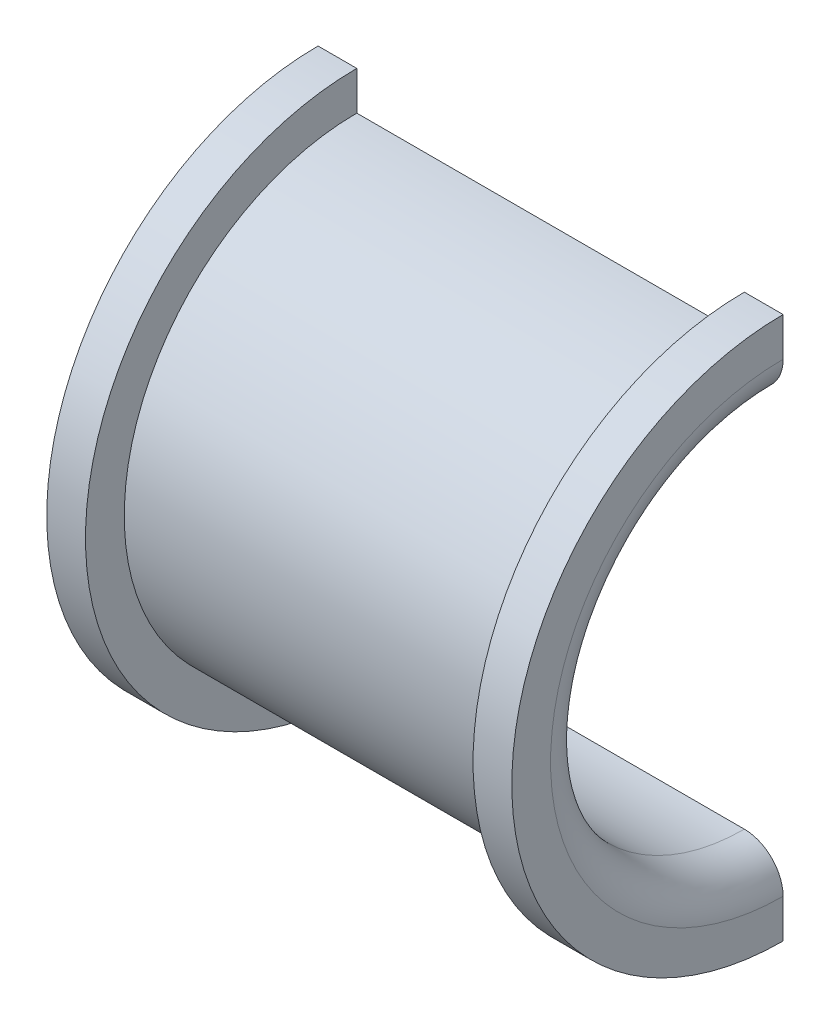
ISO-10303-21;
HEADER;
FILE_DESCRIPTION(('STEP AP214'),'2;1');
FILE_NAME('part.step','',(''),(''),'','','');
FILE_SCHEMA(('AUTOMOTIVE_DESIGN { 1 0 10303 214 1 1 1 1 }'));
ENDSEC;
DATA;
#1=APPLICATION_CONTEXT('core data for automotive mechanical design processes');
#2=APPLICATION_PROTOCOL_DEFINITION('international standard','automotive_design',2000,#1);
#3=PRODUCT_CONTEXT('',#1,'mechanical');
#4=PRODUCT('Part','Part','',(#3));
#5=PRODUCT_RELATED_PRODUCT_CATEGORY('part','',(#4));
#6=PRODUCT_DEFINITION_FORMATION('','',#4);
#7=PRODUCT_DEFINITION_CONTEXT('part definition',#1,'design');
#8=PRODUCT_DEFINITION('design','',#6,#7);
#9=PRODUCT_DEFINITION_SHAPE('','',#8);
#10=(LENGTH_UNIT() NAMED_UNIT(*) SI_UNIT(.MILLI.,.METRE.));
#11=(NAMED_UNIT(*) PLANE_ANGLE_UNIT() SI_UNIT($,.RADIAN.));
#12=(NAMED_UNIT(*) SI_UNIT($,.STERADIAN.) SOLID_ANGLE_UNIT());
#13=UNCERTAINTY_MEASURE_WITH_UNIT(LENGTH_MEASURE(1.E-05),#10,'distance_accuracy_value','');
#14=(GEOMETRIC_REPRESENTATION_CONTEXT(3) GLOBAL_UNCERTAINTY_ASSIGNED_CONTEXT((#13)) GLOBAL_UNIT_ASSIGNED_CONTEXT((#10,
#11,#12)) REPRESENTATION_CONTEXT('',''));
#15=CARTESIAN_POINT('',(0.,0.,0.));
#16=DIRECTION('',(0.,0.,1.));
#17=DIRECTION('',(1.,0.,0.));
#18=AXIS2_PLACEMENT_3D('',#15,#16,#17);
#19=CARTESIAN_POINT('',(25.,0.,0.));
#20=DIRECTION('',(-1.,0.,0.));
#21=DIRECTION('',(0.,0.,1.));
#22=AXIS2_PLACEMENT_3D('',#19,#20,#21);
#23=CYLINDRICAL_SURFACE('',#22,30.);
#24=CARTESIAN_POINT('',(25.,0.,0.));
#25=DIRECTION('',(1.,0.,0.));
#26=DIRECTION('',(0.,0.,-1.));
#27=AXIS2_PLACEMENT_3D('',#24,#25,#26);
#28=CIRCLE('',#27,30.);
#29=CARTESIAN_POINT('',(25.,30.,0.));
#30=VERTEX_POINT('',#29);
#31=CARTESIAN_POINT('',(25.,-30.0000000000001,0.));
#32=VERTEX_POINT('',#31);
#33=EDGE_CURVE('E149',#30,#32,#28,.T.);
#34=ORIENTED_EDGE('',*,*,#33,.F.);
#35=DIRECTION('',(-1.,0.,0.));
#36=VECTOR('',#35,1.);
#37=CARTESIAN_POINT('',(25.,30.,0.));
#38=LINE('',#37,#36);
#39=CARTESIAN_POINT('',(-25.,30.,0.));
#40=VERTEX_POINT('',#39);
#41=EDGE_CURVE('E190',#30,#40,#38,.T.);
#42=ORIENTED_EDGE('',*,*,#41,.T.);
#43=CARTESIAN_POINT('',(-25.,0.,0.));
#44=DIRECTION('',(1.,0.,0.));
#45=DIRECTION('',(0.,0.,-1.));
#46=AXIS2_PLACEMENT_3D('',#43,#44,#45);
#47=CIRCLE('',#46,30.);
#48=CARTESIAN_POINT('',(-25.,-30.0000000000001,0.));
#49=VERTEX_POINT('',#48);
#50=EDGE_CURVE('E136',#40,#49,#47,.T.);
#51=ORIENTED_EDGE('',*,*,#50,.T.);
#52=DIRECTION('',(-1.,0.,0.));
#53=VECTOR('',#52,1.);
#54=CARTESIAN_POINT('',(25.,-30.0000000000001,0.));
#55=LINE('',#54,#53);
#56=EDGE_CURVE('E198',#49,#32,#55,.F.);
#57=ORIENTED_EDGE('',*,*,#56,.T.);
#58=EDGE_LOOP('',(#34,#42,#51,#57));
#59=FACE_BOUND('',#58,.T.);
#60=ADVANCED_FACE('F36',(#59),#23,.T.);
#61=CARTESIAN_POINT('',(25.,0.,0.));
#62=DIRECTION('',(-1.,0.,0.));
#63=DIRECTION('',(0.,0.,1.));
#64=AXIS2_PLACEMENT_3D('',#61,#62,#63);
#65=CYLINDRICAL_SURFACE('',#64,25.);
#66=DIRECTION('',(-1.,0.,0.));
#67=VECTOR('',#66,1.);
#68=CARTESIAN_POINT('',(25.,25.,0.));
#69=LINE('',#68,#67);
#70=CARTESIAN_POINT('',(25.,25.,0.));
#71=VERTEX_POINT('',#70);
#72=CARTESIAN_POINT('',(-25.,25.,0.));
#73=VERTEX_POINT('',#72);
#74=EDGE_CURVE('E165',#71,#73,#69,.T.);
#75=ORIENTED_EDGE('',*,*,#74,.F.);
#76=CARTESIAN_POINT('',(25.,0.,0.));
#77=DIRECTION('',(1.,0.,0.));
#78=DIRECTION('',(0.,0.,-1.));
#79=AXIS2_PLACEMENT_3D('',#76,#77,#78);
#80=CIRCLE('',#79,25.);
#81=CARTESIAN_POINT('',(25.,-25.0000000000002,0.));
#82=VERTEX_POINT('',#81);
#83=EDGE_CURVE('E156',#71,#82,#80,.T.);
#84=ORIENTED_EDGE('',*,*,#83,.T.);
#85=DIRECTION('',(-1.,0.,0.));
#86=VECTOR('',#85,1.);
#87=CARTESIAN_POINT('',(25.,-25.0000000000002,0.));
#88=LINE('',#87,#86);
#89=CARTESIAN_POINT('',(-25.,-25.0000000000002,0.));
#90=VERTEX_POINT('',#89);
#91=EDGE_CURVE('E50',#90,#82,#88,.F.);
#92=ORIENTED_EDGE('',*,*,#91,.F.);
#93=CARTESIAN_POINT('',(-25.,0.,0.));
#94=DIRECTION('',(-1.,0.,0.));
#95=DIRECTION('',(0.,0.,1.));
#96=AXIS2_PLACEMENT_3D('',#93,#94,#95);
#97=CIRCLE('',#96,25.);
#98=EDGE_CURVE('E159',#90,#73,#97,.T.);
#99=ORIENTED_EDGE('',*,*,#98,.T.);
#100=EDGE_LOOP('',(#75,#84,#92,#99));
#101=FACE_BOUND('',#100,.T.);
#102=ADVANCED_FACE('F170',(#101),#65,.F.);
#103=CARTESIAN_POINT('',(30.,0.,0.));
#104=DIRECTION('',(1.,0.,0.));
#105=DIRECTION('',(0.,0.,-1.));
#106=AXIS2_PLACEMENT_3D('',#103,#104,#105);
#107=PLANE('',#106);
#108=DIRECTION('',(0.,-1.,0.));
#109=VECTOR('',#108,1.);
#110=CARTESIAN_POINT('',(30.,0.,0.));
#111=LINE('',#110,#109);
#112=CARTESIAN_POINT('',(30.,35.,0.));
#113=VERTEX_POINT('',#112);
#114=CARTESIAN_POINT('',(30.,30.,0.));
#115=VERTEX_POINT('',#114);
#116=EDGE_CURVE('E58',#113,#115,#111,.T.);
#117=ORIENTED_EDGE('',*,*,#116,.F.);
#118=CARTESIAN_POINT('',(30.,0.,0.));
#119=DIRECTION('',(1.,0.,0.));
#120=DIRECTION('',(0.,0.,-1.));
#121=AXIS2_PLACEMENT_3D('',#118,#119,#120);
#122=CIRCLE('',#121,35.);
#123=CARTESIAN_POINT('',(30.,-35.,0.));
#124=VERTEX_POINT('',#123);
#125=EDGE_CURVE('E146',#113,#124,#122,.T.);
#126=ORIENTED_EDGE('',*,*,#125,.T.);
#127=CARTESIAN_POINT('',(30.,-30.0000000000001,0.));
#128=VERTEX_POINT('',#127);
#129=EDGE_CURVE('E131',#128,#124,#111,.T.);
#130=ORIENTED_EDGE('',*,*,#129,.F.);
#131=CARTESIAN_POINT('',(30.,0.,0.));
#132=DIRECTION('',(1.,0.,0.));
#133=DIRECTION('',(0.,0.,-1.));
#134=AXIS2_PLACEMENT_3D('',#131,#132,#133);
#135=CIRCLE('',#134,30.);
#136=EDGE_CURVE('E162',#128,#115,#135,.F.);
#137=ORIENTED_EDGE('',*,*,#136,.T.);
#138=EDGE_LOOP('',(#117,#126,#130,#137));
#139=FACE_BOUND('',#138,.T.);
#140=ADVANCED_FACE('F177',(#139),#107,.T.);
#141=CARTESIAN_POINT('',(25.,0.,0.));
#142=DIRECTION('',(1.,0.,0.));
#143=DIRECTION('',(0.,0.,-1.));
#144=AXIS2_PLACEMENT_3D('',#141,#142,#143);
#145=PLANE('',#144);
#146=CARTESIAN_POINT('',(25.,0.,0.));
#147=DIRECTION('',(1.,0.,0.));
#148=DIRECTION('',(0.,0.,-1.));
#149=AXIS2_PLACEMENT_3D('',#146,#147,#148);
#150=CIRCLE('',#149,35.);
#151=CARTESIAN_POINT('',(25.,35.,0.));
#152=VERTEX_POINT('',#151);
#153=CARTESIAN_POINT('',(25.,-35.,0.));
#154=VERTEX_POINT('',#153);
#155=EDGE_CURVE('E139',#152,#154,#150,.T.);
#156=ORIENTED_EDGE('',*,*,#155,.F.);
#157=DIRECTION('',(0.,-1.,0.));
#158=VECTOR('',#157,1.);
#159=CARTESIAN_POINT('',(25.,0.,0.));
#160=LINE('',#159,#158);
#161=EDGE_CURVE('E187',#152,#30,#160,.T.);
#162=ORIENTED_EDGE('',*,*,#161,.T.);
#163=ORIENTED_EDGE('',*,*,#33,.T.);
#164=EDGE_CURVE('E191',#32,#154,#160,.T.);
#165=ORIENTED_EDGE('',*,*,#164,.T.);
#166=EDGE_LOOP('',(#156,#162,#163,#165));
#167=FACE_BOUND('',#166,.T.);
#168=ADVANCED_FACE('F206',(#167),#145,.F.);
#169=CARTESIAN_POINT('',(30.,0.,0.));
#170=DIRECTION('',(-1.,0.,0.));
#171=DIRECTION('',(0.,0.,1.));
#172=AXIS2_PLACEMENT_3D('',#169,#170,#171);
#173=CYLINDRICAL_SURFACE('',#172,35.);
#174=ORIENTED_EDGE('',*,*,#125,.F.);
#175=DIRECTION('',(-1.,0.,0.));
#176=VECTOR('',#175,1.);
#177=CARTESIAN_POINT('',(30.,35.,0.));
#178=LINE('',#177,#176);
#179=EDGE_CURVE('E184',#113,#152,#178,.T.);
#180=ORIENTED_EDGE('',*,*,#179,.T.);
#181=ORIENTED_EDGE('',*,*,#155,.T.);
#182=DIRECTION('',(-1.,0.,0.));
#183=VECTOR('',#182,1.);
#184=CARTESIAN_POINT('',(30.,-35.,0.));
#185=LINE('',#184,#183);
#186=EDGE_CURVE('E197',#154,#124,#185,.F.);
#187=ORIENTED_EDGE('',*,*,#186,.T.);
#188=EDGE_LOOP('',(#174,#180,#181,#187));
#189=FACE_BOUND('',#188,.T.);
#190=ADVANCED_FACE('F208',(#189),#173,.T.);
#191=CARTESIAN_POINT('',(-30.,0.,0.));
#192=DIRECTION('',(1.,0.,0.));
#193=DIRECTION('',(0.,0.,-1.));
#194=AXIS2_PLACEMENT_3D('',#191,#192,#193);
#195=CYLINDRICAL_SURFACE('',#194,35.);
#196=DIRECTION('',(1.,0.,0.));
#197=VECTOR('',#196,1.);
#198=CARTESIAN_POINT('',(-30.,-35.,0.));
#199=LINE('',#198,#197);
#200=CARTESIAN_POINT('',(-25.,-35.,0.));
#201=VERTEX_POINT('',#200);
#202=CARTESIAN_POINT('',(-30.,-35.,0.));
#203=VERTEX_POINT('',#202);
#204=EDGE_CURVE('E141',#201,#203,#199,.F.);
#205=ORIENTED_EDGE('',*,*,#204,.F.);
#206=CARTESIAN_POINT('',(-25.,0.,0.));
#207=DIRECTION('',(1.,0.,0.));
#208=DIRECTION('',(0.,0.,-1.));
#209=AXIS2_PLACEMENT_3D('',#206,#207,#208);
#210=CIRCLE('',#209,35.);
#211=CARTESIAN_POINT('',(-25.,35.,0.));
#212=VERTEX_POINT('',#211);
#213=EDGE_CURVE('E130',#212,#201,#210,.T.);
#214=ORIENTED_EDGE('',*,*,#213,.F.);
#215=DIRECTION('',(1.,0.,0.));
#216=VECTOR('',#215,1.);
#217=CARTESIAN_POINT('',(-30.,35.,0.));
#218=LINE('',#217,#216);
#219=CARTESIAN_POINT('',(-30.,35.,0.));
#220=VERTEX_POINT('',#219);
#221=EDGE_CURVE('E113',#220,#212,#218,.T.);
#222=ORIENTED_EDGE('',*,*,#221,.F.);
#223=CARTESIAN_POINT('',(-30.,0.,0.));
#224=DIRECTION('',(1.,0.,0.));
#225=DIRECTION('',(0.,0.,-1.));
#226=AXIS2_PLACEMENT_3D('',#223,#224,#225);
#227=CIRCLE('',#226,35.);
#228=EDGE_CURVE('E128',#220,#203,#227,.T.);
#229=ORIENTED_EDGE('',*,*,#228,.T.);
#230=EDGE_LOOP('',(#205,#214,#222,#229));
#231=FACE_BOUND('',#230,.T.);
#232=ADVANCED_FACE('F127',(#231),#195,.T.);
#233=CARTESIAN_POINT('',(-30.,0.,0.));
#234=DIRECTION('',(-1.,0.,0.));
#235=DIRECTION('',(0.,0.,-1.));
#236=AXIS2_PLACEMENT_3D('',#233,#234,#235);
#237=PLANE('',#236);
#238=DIRECTION('',(0.,-1.,0.));
#239=VECTOR('',#238,1.);
#240=CARTESIAN_POINT('',(-30.,-51.4182003302543,0.));
#241=LINE('',#240,#239);
#242=CARTESIAN_POINT('',(-30.,-30.0000000000001,0.));
#243=VERTEX_POINT('',#242);
#244=EDGE_CURVE('E121',#243,#203,#241,.T.);
#245=ORIENTED_EDGE('',*,*,#244,.T.);
#246=ORIENTED_EDGE('',*,*,#228,.F.);
#247=CARTESIAN_POINT('',(-30.,30.,0.));
#248=VERTEX_POINT('',#247);
#249=EDGE_CURVE('E110',#220,#248,#241,.T.);
#250=ORIENTED_EDGE('',*,*,#249,.T.);
#251=CARTESIAN_POINT('',(-30.,0.,0.));
#252=DIRECTION('',(-1.,0.,0.));
#253=DIRECTION('',(0.,0.,1.));
#254=AXIS2_PLACEMENT_3D('',#251,#252,#253);
#255=CIRCLE('',#254,30.);
#256=EDGE_CURVE('E153',#248,#243,#255,.F.);
#257=ORIENTED_EDGE('',*,*,#256,.T.);
#258=EDGE_LOOP('',(#245,#246,#250,#257));
#259=FACE_BOUND('',#258,.T.);
#260=ADVANCED_FACE('F135',(#259),#237,.T.);
#261=CARTESIAN_POINT('',(-25.,0.,0.));
#262=DIRECTION('',(-1.,0.,0.));
#263=DIRECTION('',(0.,0.,-1.));
#264=AXIS2_PLACEMENT_3D('',#261,#262,#263);
#265=PLANE('',#264);
#266=ORIENTED_EDGE('',*,*,#213,.T.);
#267=DIRECTION('',(0.,1.,0.));
#268=VECTOR('',#267,1.);
#269=CARTESIAN_POINT('',(-25.,0.,0.));
#270=LINE('',#269,#268);
#271=EDGE_CURVE('E194',#201,#49,#270,.T.);
#272=ORIENTED_EDGE('',*,*,#271,.T.);
#273=ORIENTED_EDGE('',*,*,#50,.F.);
#274=EDGE_CURVE('E132',#40,#212,#270,.T.);
#275=ORIENTED_EDGE('',*,*,#274,.T.);
#276=EDGE_LOOP('',(#266,#272,#273,#275));
#277=FACE_BOUND('',#276,.T.);
#278=ADVANCED_FACE('F211',(#277),#265,.F.);
#279=CARTESIAN_POINT('',(-25.,0.,0.));
#280=DIRECTION('',(-1.,0.,0.));
#281=DIRECTION('',(0.,0.,1.));
#282=AXIS2_PLACEMENT_3D('',#279,#280,#281);
#283=TOROIDAL_SURFACE('',#282,30.,5.);
#284=CARTESIAN_POINT('',(-25.,30.,0.));
#285=DIRECTION('',(0.,0.,1.));
#286=DIRECTION('',(1.,0.,0.));
#287=AXIS2_PLACEMENT_3D('',#284,#285,#286);
#288=CIRCLE('',#287,5.);
#289=EDGE_CURVE('E116',#73,#248,#288,.F.);
#290=ORIENTED_EDGE('',*,*,#289,.F.);
#291=ORIENTED_EDGE('',*,*,#98,.F.);
#292=CARTESIAN_POINT('',(-25.,-30.0000000000001,0.));
#293=DIRECTION('',(0.,0.,1.));
#294=DIRECTION('',(1.,0.,0.));
#295=AXIS2_PLACEMENT_3D('',#292,#293,#294);
#296=CIRCLE('',#295,5.);
#297=EDGE_CURVE('E180',#243,#90,#296,.F.);
#298=ORIENTED_EDGE('',*,*,#297,.F.);
#299=ORIENTED_EDGE('',*,*,#256,.F.);
#300=EDGE_LOOP('',(#290,#291,#298,#299));
#301=FACE_BOUND('',#300,.T.);
#302=ADVANCED_FACE('F214',(#301),#283,.T.);
#303=CARTESIAN_POINT('',(25.,0.,0.));
#304=DIRECTION('',(1.,0.,0.));
#305=DIRECTION('',(0.,0.,-1.));
#306=AXIS2_PLACEMENT_3D('',#303,#304,#305);
#307=TOROIDAL_SURFACE('',#306,30.,5.);
#308=CARTESIAN_POINT('',(25.,-30.0000000000001,0.));
#309=DIRECTION('',(0.,0.,1.));
#310=DIRECTION('',(1.,0.,0.));
#311=AXIS2_PLACEMENT_3D('',#308,#309,#310);
#312=CIRCLE('',#311,5.);
#313=EDGE_CURVE('E11',#82,#128,#312,.F.);
#314=ORIENTED_EDGE('',*,*,#313,.F.);
#315=ORIENTED_EDGE('',*,*,#83,.F.);
#316=CARTESIAN_POINT('',(25.,30.,0.));
#317=DIRECTION('',(0.,0.,1.));
#318=DIRECTION('',(1.,0.,0.));
#319=AXIS2_PLACEMENT_3D('',#316,#317,#318);
#320=CIRCLE('',#319,5.);
#321=EDGE_CURVE('E44',#115,#71,#320,.F.);
#322=ORIENTED_EDGE('',*,*,#321,.F.);
#323=ORIENTED_EDGE('',*,*,#136,.F.);
#324=EDGE_LOOP('',(#314,#315,#322,#323));
#325=FACE_BOUND('',#324,.T.);
#326=ADVANCED_FACE('F38',(#325),#307,.T.);
#327=CARTESIAN_POINT('',(-30.,-51.4182003302543,0.));
#328=DIRECTION('',(0.,0.,1.));
#329=DIRECTION('',(1.,0.,0.));
#330=AXIS2_PLACEMENT_3D('',#327,#328,#329);
#331=PLANE('',#330);
#332=ORIENTED_EDGE('',*,*,#221,.T.);
#333=ORIENTED_EDGE('',*,*,#274,.F.);
#334=ORIENTED_EDGE('',*,*,#41,.F.);
#335=ORIENTED_EDGE('',*,*,#161,.F.);
#336=ORIENTED_EDGE('',*,*,#179,.F.);
#337=ORIENTED_EDGE('',*,*,#116,.T.);
#338=ORIENTED_EDGE('',*,*,#321,.T.);
#339=ORIENTED_EDGE('',*,*,#74,.T.);
#340=ORIENTED_EDGE('',*,*,#289,.T.);
#341=ORIENTED_EDGE('',*,*,#249,.F.);
#342=EDGE_LOOP('',(#332,#333,#334,#335,#336,#337,#338,#339,#340,#341));
#343=FACE_BOUND('',#342,.T.);
#344=ADVANCED_FACE('F112',(#343),#331,.F.);
#345=ORIENTED_EDGE('',*,*,#204,.T.);
#346=ORIENTED_EDGE('',*,*,#244,.F.);
#347=ORIENTED_EDGE('',*,*,#297,.T.);
#348=ORIENTED_EDGE('',*,*,#91,.T.);
#349=ORIENTED_EDGE('',*,*,#313,.T.);
#350=ORIENTED_EDGE('',*,*,#129,.T.);
#351=ORIENTED_EDGE('',*,*,#186,.F.);
#352=ORIENTED_EDGE('',*,*,#164,.F.);
#353=ORIENTED_EDGE('',*,*,#56,.F.);
#354=ORIENTED_EDGE('',*,*,#271,.F.);
#355=EDGE_LOOP('',(#345,#346,#347,#348,#349,#350,#351,#352,#353,#354));
#356=FACE_BOUND('',#355,.T.);
#357=ADVANCED_FACE('F174',(#356),#331,.F.);
#358=CLOSED_SHELL('',(#60,#102,#140,#168,#190,#232,#260,#278,#302,#326,#344,#357));
#359=MANIFOLD_SOLID_BREP('B2',#358);
#360=ADVANCED_BREP_SHAPE_REPRESENTATION('',(#18,#359),#14);
#361=SHAPE_DEFINITION_REPRESENTATION(#9,#360);
ENDSEC;
END-ISO-10303-21;
